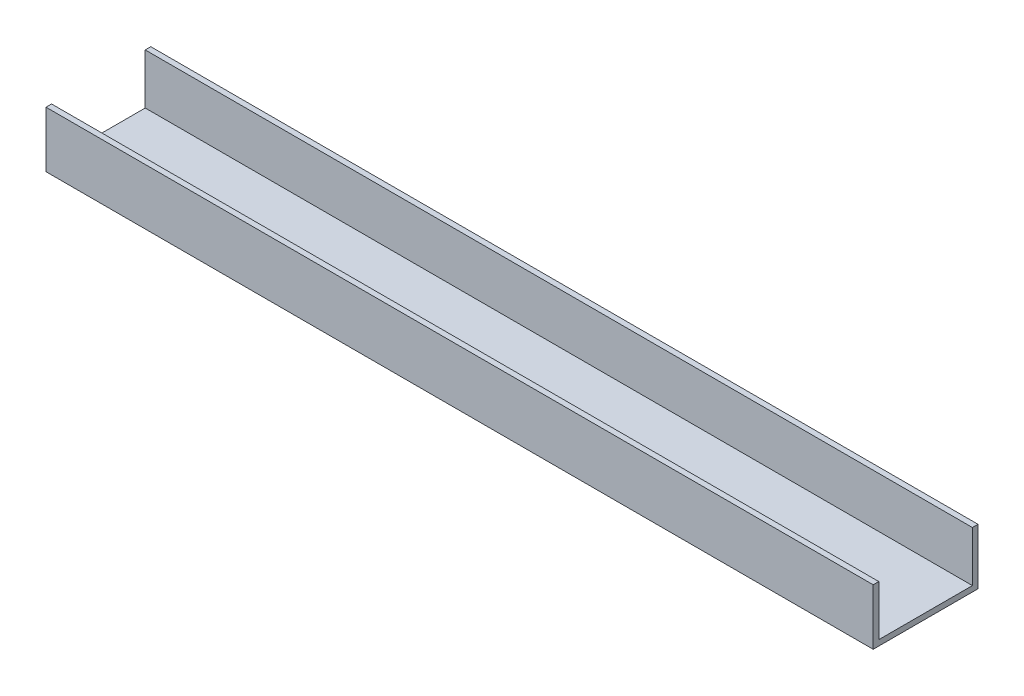
ISO-10303-21;
HEADER;
FILE_DESCRIPTION(('STEP AP214'),'2;1');
FILE_NAME('part.step','',(''),(''),'','','');
FILE_SCHEMA(('AUTOMOTIVE_DESIGN { 1 0 10303 214 1 1 1 1 }'));
ENDSEC;
DATA;
#1=APPLICATION_CONTEXT('core data for automotive mechanical design processes');
#2=APPLICATION_PROTOCOL_DEFINITION('international standard','automotive_design',2000,#1);
#3=PRODUCT_CONTEXT('',#1,'mechanical');
#4=PRODUCT('Part','Part','',(#3));
#5=PRODUCT_RELATED_PRODUCT_CATEGORY('part','',(#4));
#6=PRODUCT_DEFINITION_FORMATION('','',#4);
#7=PRODUCT_DEFINITION_CONTEXT('part definition',#1,'design');
#8=PRODUCT_DEFINITION('design','',#6,#7);
#9=PRODUCT_DEFINITION_SHAPE('','',#8);
#10=(LENGTH_UNIT() NAMED_UNIT(*) SI_UNIT(.MILLI.,.METRE.));
#11=(NAMED_UNIT(*) PLANE_ANGLE_UNIT() SI_UNIT($,.RADIAN.));
#12=(NAMED_UNIT(*) SI_UNIT($,.STERADIAN.) SOLID_ANGLE_UNIT());
#13=UNCERTAINTY_MEASURE_WITH_UNIT(LENGTH_MEASURE(1.E-05),#10,'distance_accuracy_value','');
#14=(GEOMETRIC_REPRESENTATION_CONTEXT(3) GLOBAL_UNCERTAINTY_ASSIGNED_CONTEXT((#13)) GLOBAL_UNIT_ASSIGNED_CONTEXT((#10,
#11,#12)) REPRESENTATION_CONTEXT('',''));
#15=CARTESIAN_POINT('',(0.,0.,0.));
#16=DIRECTION('',(0.,0.,1.));
#17=DIRECTION('',(1.,0.,0.));
#18=AXIS2_PLACEMENT_3D('',#15,#16,#17);
#19=CARTESIAN_POINT('',(0.,4.,0.));
#20=DIRECTION('',(0.,-1.,0.));
#21=DIRECTION('',(0.,0.,-1.));
#22=AXIS2_PLACEMENT_3D('',#19,#20,#21);
#23=PLANE('',#22);
#24=DIRECTION('',(1.,0.,0.));
#25=VECTOR('',#24,1.);
#26=CARTESIAN_POINT('',(592.,4.,-71.));
#27=LINE('',#26,#25);
#28=CARTESIAN_POINT('',(0.,4.,-70.9999999999999));
#29=VERTEX_POINT('',#28);
#30=CARTESIAN_POINT('',(592.,4.,-70.9999999999999));
#31=VERTEX_POINT('',#30);
#32=EDGE_CURVE('E58',#29,#31,#27,.T.);
#33=ORIENTED_EDGE('',*,*,#32,.F.);
#34=DIRECTION('',(0.,0.,1.));
#35=VECTOR('',#34,1.);
#36=CARTESIAN_POINT('',(0.,4.,0.));
#37=LINE('',#36,#35);
#38=CARTESIAN_POINT('',(0.,4.,-4.));
#39=VERTEX_POINT('',#38);
#40=EDGE_CURVE('E154',#29,#39,#37,.T.);
#41=ORIENTED_EDGE('',*,*,#40,.T.);
#42=DIRECTION('',(-1.,0.,0.));
#43=VECTOR('',#42,1.);
#44=CARTESIAN_POINT('',(0.,4.,-4.));
#45=LINE('',#44,#43);
#46=CARTESIAN_POINT('',(592.,4.,-4.));
#47=VERTEX_POINT('',#46);
#48=EDGE_CURVE('E130',#47,#39,#45,.T.);
#49=ORIENTED_EDGE('',*,*,#48,.F.);
#50=DIRECTION('',(0.,0.,-1.));
#51=VECTOR('',#50,1.);
#52=CARTESIAN_POINT('',(592.,4.,0.));
#53=LINE('',#52,#51);
#54=EDGE_CURVE('E63',#47,#31,#53,.T.);
#55=ORIENTED_EDGE('',*,*,#54,.T.);
#56=EDGE_LOOP('',(#33,#41,#49,#55));
#57=FACE_BOUND('',#56,.T.);
#58=ADVANCED_FACE('F43',(#57),#23,.F.);
#59=CARTESIAN_POINT('',(0.,4.,0.));
#60=DIRECTION('',(1.,0.,0.));
#61=DIRECTION('',(0.,0.,-1.));
#62=AXIS2_PLACEMENT_3D('',#59,#60,#61);
#63=PLANE('',#62);
#64=DIRECTION('',(0.,0.,1.));
#65=VECTOR('',#64,1.);
#66=CARTESIAN_POINT('',(0.,0.,0.));
#67=LINE('',#66,#65);
#68=CARTESIAN_POINT('',(0.,0.,-75.));
#69=VERTEX_POINT('',#68);
#70=CARTESIAN_POINT('',(0.,0.,0.));
#71=VERTEX_POINT('',#70);
#72=EDGE_CURVE('E153',#69,#71,#67,.T.);
#73=ORIENTED_EDGE('',*,*,#72,.T.);
#74=DIRECTION('',(0.,-1.,0.));
#75=VECTOR('',#74,1.);
#76=CARTESIAN_POINT('',(0.,4.,0.));
#77=LINE('',#76,#75);
#78=CARTESIAN_POINT('',(0.,40.,0.));
#79=VERTEX_POINT('',#78);
#80=EDGE_CURVE('E11',#79,#71,#77,.T.);
#81=ORIENTED_EDGE('',*,*,#80,.F.);
#82=DIRECTION('',(0.,0.,1.));
#83=VECTOR('',#82,1.);
#84=CARTESIAN_POINT('',(0.,40.,0.));
#85=LINE('',#84,#83);
#86=CARTESIAN_POINT('',(0.,40.,-4.));
#87=VERTEX_POINT('',#86);
#88=EDGE_CURVE('E135',#87,#79,#85,.T.);
#89=ORIENTED_EDGE('',*,*,#88,.F.);
#90=DIRECTION('',(0.,-1.,0.));
#91=VECTOR('',#90,1.);
#92=CARTESIAN_POINT('',(0.,40.,-4.));
#93=LINE('',#92,#91);
#94=EDGE_CURVE('E145',#87,#39,#93,.T.);
#95=ORIENTED_EDGE('',*,*,#94,.T.);
#96=ORIENTED_EDGE('',*,*,#40,.F.);
#97=DIRECTION('',(0.,-1.,0.));
#98=VECTOR('',#97,1.);
#99=CARTESIAN_POINT('',(0.,40.,-70.9999999999999));
#100=LINE('',#99,#98);
#101=CARTESIAN_POINT('',(0.,40.,-70.9999999999999));
#102=VERTEX_POINT('',#101);
#103=EDGE_CURVE('E122',#102,#29,#100,.T.);
#104=ORIENTED_EDGE('',*,*,#103,.F.);
#105=DIRECTION('',(0.,0.,1.));
#106=VECTOR('',#105,1.);
#107=CARTESIAN_POINT('',(0.,40.,-75.));
#108=LINE('',#107,#106);
#109=CARTESIAN_POINT('',(0.,40.,-75.));
#110=VERTEX_POINT('',#109);
#111=EDGE_CURVE('E113',#110,#102,#108,.T.);
#112=ORIENTED_EDGE('',*,*,#111,.F.);
#113=DIRECTION('',(0.,-1.,0.));
#114=VECTOR('',#113,1.);
#115=CARTESIAN_POINT('',(0.,4.,-75.));
#116=LINE('',#115,#114);
#117=EDGE_CURVE('E158',#110,#69,#116,.T.);
#118=ORIENTED_EDGE('',*,*,#117,.T.);
#119=EDGE_LOOP('',(#73,#81,#89,#95,#96,#104,#112,#118));
#120=FACE_BOUND('',#119,.T.);
#121=ADVANCED_FACE('F45',(#120),#63,.F.);
#122=CARTESIAN_POINT('',(0.,4.,0.));
#123=DIRECTION('',(0.,0.,-1.));
#124=DIRECTION('',(-1.,0.,0.));
#125=AXIS2_PLACEMENT_3D('',#122,#123,#124);
#126=PLANE('',#125);
#127=DIRECTION('',(1.,0.,0.));
#128=VECTOR('',#127,1.);
#129=CARTESIAN_POINT('',(0.,0.,0.));
#130=LINE('',#129,#128);
#131=CARTESIAN_POINT('',(592.,0.,0.));
#132=VERTEX_POINT('',#131);
#133=EDGE_CURVE('E161',#71,#132,#130,.T.);
#134=ORIENTED_EDGE('',*,*,#133,.T.);
#135=DIRECTION('',(0.,-1.,0.));
#136=VECTOR('',#135,1.);
#137=CARTESIAN_POINT('',(592.,4.,0.));
#138=LINE('',#137,#136);
#139=CARTESIAN_POINT('',(592.,40.,0.));
#140=VERTEX_POINT('',#139);
#141=EDGE_CURVE('E51',#140,#132,#138,.T.);
#142=ORIENTED_EDGE('',*,*,#141,.F.);
#143=DIRECTION('',(1.,0.,0.));
#144=VECTOR('',#143,1.);
#145=CARTESIAN_POINT('',(0.,40.,0.));
#146=LINE('',#145,#144);
#147=EDGE_CURVE('E138',#79,#140,#146,.T.);
#148=ORIENTED_EDGE('',*,*,#147,.F.);
#149=ORIENTED_EDGE('',*,*,#80,.T.);
#150=EDGE_LOOP('',(#134,#142,#148,#149));
#151=FACE_BOUND('',#150,.T.);
#152=ADVANCED_FACE('F189',(#151),#126,.F.);
#153=CARTESIAN_POINT('',(592.,4.,0.));
#154=DIRECTION('',(-1.,0.,0.));
#155=DIRECTION('',(0.,0.,1.));
#156=AXIS2_PLACEMENT_3D('',#153,#154,#155);
#157=PLANE('',#156);
#158=DIRECTION('',(0.,0.,-1.));
#159=VECTOR('',#158,1.);
#160=CARTESIAN_POINT('',(592.,0.,0.));
#161=LINE('',#160,#159);
#162=CARTESIAN_POINT('',(592.,0.,-75.));
#163=VERTEX_POINT('',#162);
#164=EDGE_CURVE('E163',#132,#163,#161,.T.);
#165=ORIENTED_EDGE('',*,*,#164,.T.);
#166=DIRECTION('',(0.,-1.,0.));
#167=VECTOR('',#166,1.);
#168=CARTESIAN_POINT('',(592.,4.,-75.));
#169=LINE('',#168,#167);
#170=CARTESIAN_POINT('',(592.,40.,-75.));
#171=VERTEX_POINT('',#170);
#172=EDGE_CURVE('E126',#171,#163,#169,.T.);
#173=ORIENTED_EDGE('',*,*,#172,.F.);
#174=DIRECTION('',(0.,0.,-1.));
#175=VECTOR('',#174,1.);
#176=CARTESIAN_POINT('',(592.,40.,-75.));
#177=LINE('',#176,#175);
#178=CARTESIAN_POINT('',(592.,40.,-71.));
#179=VERTEX_POINT('',#178);
#180=EDGE_CURVE('E111',#179,#171,#177,.T.);
#181=ORIENTED_EDGE('',*,*,#180,.F.);
#182=DIRECTION('',(0.,-1.,0.));
#183=VECTOR('',#182,1.);
#184=CARTESIAN_POINT('',(592.,40.,-71.));
#185=LINE('',#184,#183);
#186=EDGE_CURVE('E117',#179,#31,#185,.T.);
#187=ORIENTED_EDGE('',*,*,#186,.T.);
#188=ORIENTED_EDGE('',*,*,#54,.F.);
#189=DIRECTION('',(0.,-1.,0.));
#190=VECTOR('',#189,1.);
#191=CARTESIAN_POINT('',(592.,40.,-4.));
#192=LINE('',#191,#190);
#193=CARTESIAN_POINT('',(592.,40.,-4.));
#194=VERTEX_POINT('',#193);
#195=EDGE_CURVE('E150',#194,#47,#192,.T.);
#196=ORIENTED_EDGE('',*,*,#195,.F.);
#197=DIRECTION('',(0.,0.,-1.));
#198=VECTOR('',#197,1.);
#199=CARTESIAN_POINT('',(592.,40.,0.));
#200=LINE('',#199,#198);
#201=EDGE_CURVE('E141',#140,#194,#200,.T.);
#202=ORIENTED_EDGE('',*,*,#201,.F.);
#203=ORIENTED_EDGE('',*,*,#141,.T.);
#204=EDGE_LOOP('',(#165,#173,#181,#187,#188,#196,#202,#203));
#205=FACE_BOUND('',#204,.T.);
#206=ADVANCED_FACE('F124',(#205),#157,.F.);
#207=CARTESIAN_POINT('',(0.,4.,-75.));
#208=DIRECTION('',(0.,0.,1.));
#209=DIRECTION('',(1.,0.,0.));
#210=AXIS2_PLACEMENT_3D('',#207,#208,#209);
#211=PLANE('',#210);
#212=DIRECTION('',(-1.,0.,0.));
#213=VECTOR('',#212,1.);
#214=CARTESIAN_POINT('',(0.,0.,-75.));
#215=LINE('',#214,#213);
#216=EDGE_CURVE('E156',#163,#69,#215,.T.);
#217=ORIENTED_EDGE('',*,*,#216,.T.);
#218=ORIENTED_EDGE('',*,*,#117,.F.);
#219=DIRECTION('',(-1.,0.,0.));
#220=VECTOR('',#219,1.);
#221=CARTESIAN_POINT('',(592.,40.,-75.));
#222=LINE('',#221,#220);
#223=EDGE_CURVE('E128',#171,#110,#222,.T.);
#224=ORIENTED_EDGE('',*,*,#223,.F.);
#225=ORIENTED_EDGE('',*,*,#172,.T.);
#226=EDGE_LOOP('',(#217,#218,#224,#225));
#227=FACE_BOUND('',#226,.T.);
#228=ADVANCED_FACE('F179',(#227),#211,.F.);
#229=CARTESIAN_POINT('',(0.,0.,0.));
#230=DIRECTION('',(0.,-1.,0.));
#231=DIRECTION('',(0.,0.,-1.));
#232=AXIS2_PLACEMENT_3D('',#229,#230,#231);
#233=PLANE('',#232);
#234=ORIENTED_EDGE('',*,*,#72,.F.);
#235=ORIENTED_EDGE('',*,*,#216,.F.);
#236=ORIENTED_EDGE('',*,*,#164,.F.);
#237=ORIENTED_EDGE('',*,*,#133,.F.);
#238=EDGE_LOOP('',(#234,#235,#236,#237));
#239=FACE_BOUND('',#238,.T.);
#240=ADVANCED_FACE('F177',(#239),#233,.T.);
#241=CARTESIAN_POINT('',(0.,40.,-4.));
#242=DIRECTION('',(0.,0.,1.));
#243=DIRECTION('',(1.,0.,0.));
#244=AXIS2_PLACEMENT_3D('',#241,#242,#243);
#245=PLANE('',#244);
#246=ORIENTED_EDGE('',*,*,#48,.T.);
#247=ORIENTED_EDGE('',*,*,#94,.F.);
#248=DIRECTION('',(-1.,0.,0.));
#249=VECTOR('',#248,1.);
#250=CARTESIAN_POINT('',(0.,40.,-4.));
#251=LINE('',#250,#249);
#252=EDGE_CURVE('E143',#194,#87,#251,.T.);
#253=ORIENTED_EDGE('',*,*,#252,.F.);
#254=ORIENTED_EDGE('',*,*,#195,.T.);
#255=EDGE_LOOP('',(#246,#247,#253,#254));
#256=FACE_BOUND('',#255,.T.);
#257=ADVANCED_FACE('F185',(#256),#245,.F.);
#258=CARTESIAN_POINT('',(0.,40.,0.));
#259=DIRECTION('',(0.,-1.,0.));
#260=DIRECTION('',(0.,0.,-1.));
#261=AXIS2_PLACEMENT_3D('',#258,#259,#260);
#262=PLANE('',#261);
#263=ORIENTED_EDGE('',*,*,#88,.T.);
#264=ORIENTED_EDGE('',*,*,#147,.T.);
#265=ORIENTED_EDGE('',*,*,#201,.T.);
#266=ORIENTED_EDGE('',*,*,#252,.T.);
#267=EDGE_LOOP('',(#263,#264,#265,#266));
#268=FACE_BOUND('',#267,.T.);
#269=ADVANCED_FACE('F188',(#268),#262,.F.);
#270=CARTESIAN_POINT('',(592.,40.,-71.));
#271=DIRECTION('',(0.,0.,-1.));
#272=DIRECTION('',(-1.,0.,0.));
#273=AXIS2_PLACEMENT_3D('',#270,#271,#272);
#274=PLANE('',#273);
#275=ORIENTED_EDGE('',*,*,#32,.T.);
#276=ORIENTED_EDGE('',*,*,#186,.F.);
#277=DIRECTION('',(1.,0.,0.));
#278=VECTOR('',#277,1.);
#279=CARTESIAN_POINT('',(592.,40.,-71.));
#280=LINE('',#279,#278);
#281=EDGE_CURVE('E106',#102,#179,#280,.T.);
#282=ORIENTED_EDGE('',*,*,#281,.F.);
#283=ORIENTED_EDGE('',*,*,#103,.T.);
#284=EDGE_LOOP('',(#275,#276,#282,#283));
#285=FACE_BOUND('',#284,.T.);
#286=ADVANCED_FACE('F120',(#285),#274,.F.);
#287=CARTESIAN_POINT('',(0.,40.,0.));
#288=DIRECTION('',(0.,-1.,0.));
#289=DIRECTION('',(0.,0.,-1.));
#290=AXIS2_PLACEMENT_3D('',#287,#288,#289);
#291=PLANE('',#290);
#292=ORIENTED_EDGE('',*,*,#180,.T.);
#293=ORIENTED_EDGE('',*,*,#223,.T.);
#294=ORIENTED_EDGE('',*,*,#111,.T.);
#295=ORIENTED_EDGE('',*,*,#281,.T.);
#296=EDGE_LOOP('',(#292,#293,#294,#295));
#297=FACE_BOUND('',#296,.T.);
#298=ADVANCED_FACE('F108',(#297),#291,.F.);
#299=CLOSED_SHELL('',(#58,#121,#152,#206,#228,#240,#257,#269,#286,#298));
#300=MANIFOLD_SOLID_BREP('B2',#299);
#301=ADVANCED_BREP_SHAPE_REPRESENTATION('',(#18,#300),#14);
#302=SHAPE_DEFINITION_REPRESENTATION(#9,#301);
ENDSEC;
END-ISO-10303-21;
